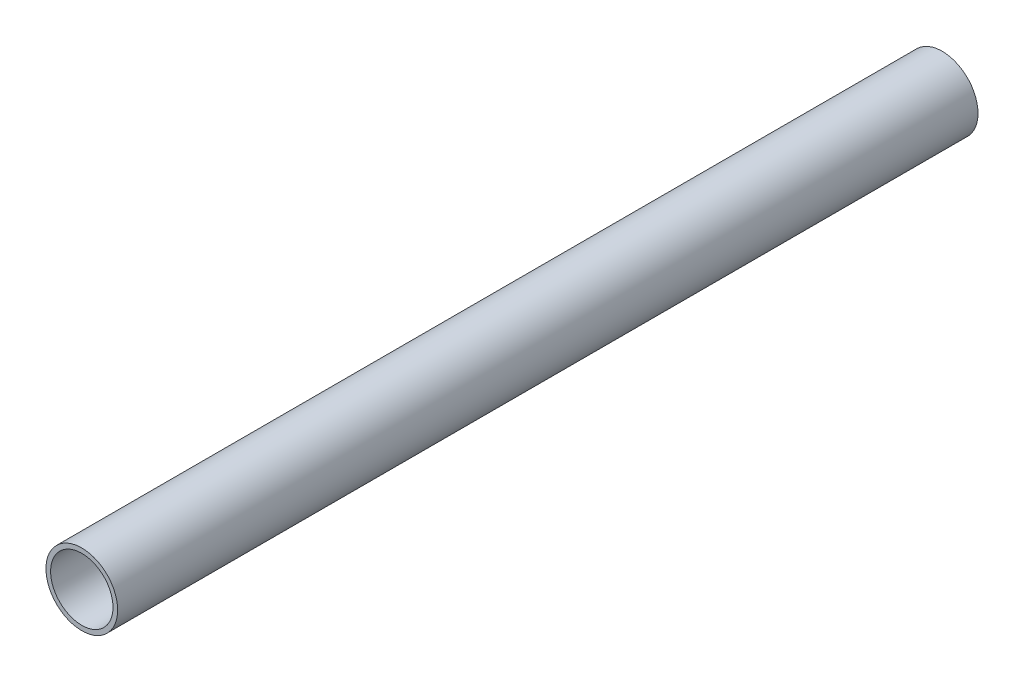
ISO-10303-21;
HEADER;
FILE_DESCRIPTION(('STEP AP214'),'2;1');
FILE_NAME('part.step','',(''),(''),'','','');
FILE_SCHEMA(('AUTOMOTIVE_DESIGN { 1 0 10303 214 1 1 1 1 }'));
ENDSEC;
DATA;
#1=APPLICATION_CONTEXT('core data for automotive mechanical design processes');
#2=APPLICATION_PROTOCOL_DEFINITION('international standard','automotive_design',2000,#1);
#3=PRODUCT_CONTEXT('',#1,'mechanical');
#4=PRODUCT('Part','Part','',(#3));
#5=PRODUCT_RELATED_PRODUCT_CATEGORY('part','',(#4));
#6=PRODUCT_DEFINITION_FORMATION('','',#4);
#7=PRODUCT_DEFINITION_CONTEXT('part definition',#1,'design');
#8=PRODUCT_DEFINITION('design','',#6,#7);
#9=PRODUCT_DEFINITION_SHAPE('','',#8);
#10=(LENGTH_UNIT() NAMED_UNIT(*) SI_UNIT(.MILLI.,.METRE.));
#11=(NAMED_UNIT(*) PLANE_ANGLE_UNIT() SI_UNIT($,.RADIAN.));
#12=(NAMED_UNIT(*) SI_UNIT($,.STERADIAN.) SOLID_ANGLE_UNIT());
#13=UNCERTAINTY_MEASURE_WITH_UNIT(LENGTH_MEASURE(1.E-05),#10,'distance_accuracy_value','');
#14=(GEOMETRIC_REPRESENTATION_CONTEXT(3) GLOBAL_UNCERTAINTY_ASSIGNED_CONTEXT((#13)) GLOBAL_UNIT_ASSIGNED_CONTEXT((#10,
#11,#12)) REPRESENTATION_CONTEXT('',''));
#15=CARTESIAN_POINT('',(0.,0.,0.));
#16=DIRECTION('',(0.,0.,1.));
#17=DIRECTION('',(1.,0.,0.));
#18=AXIS2_PLACEMENT_3D('',#15,#16,#17);
#19=CARTESIAN_POINT('',(0.,0.,152.4));
#20=DIRECTION('',(0.,0.,1.));
#21=DIRECTION('',(1.,0.,0.));
#22=AXIS2_PLACEMENT_3D('',#19,#20,#21);
#23=PLANE('',#22);
#24=CARTESIAN_POINT('',(0.,0.,152.4));
#25=DIRECTION('',(0.,0.,1.));
#26=DIRECTION('',(1.,0.,0.));
#27=AXIS2_PLACEMENT_3D('',#24,#25,#26);
#28=CIRCLE('',#27,12.7);
#29=CARTESIAN_POINT('',(12.7,0.,152.4));
#30=VERTEX_POINT('',#29);
#31=EDGE_CURVE('E10',#30,#30,#28,.T.);
#32=ORIENTED_EDGE('',*,*,#31,.T.);
#33=EDGE_LOOP('',(#32));
#34=FACE_BOUND('',#33,.T.);
#35=CARTESIAN_POINT('',(0.,0.,152.4));
#36=DIRECTION('',(0.,0.,1.));
#37=DIRECTION('',(1.,0.,0.));
#38=AXIS2_PLACEMENT_3D('',#35,#36,#37);
#39=CIRCLE('',#38,11.049);
#40=CARTESIAN_POINT('',(11.049,0.,152.4));
#41=VERTEX_POINT('',#40);
#42=EDGE_CURVE('E37',#41,#41,#39,.T.);
#43=ORIENTED_EDGE('',*,*,#42,.F.);
#44=EDGE_LOOP('',(#43));
#45=FACE_BOUND('',#44,.T.);
#46=ADVANCED_FACE('F30',(#34,#45),#23,.T.);
#47=CARTESIAN_POINT('',(0.,0.,152.4));
#48=DIRECTION('',(0.,0.,-1.));
#49=DIRECTION('',(-1.,0.,0.));
#50=AXIS2_PLACEMENT_3D('',#47,#48,#49);
#51=CYLINDRICAL_SURFACE('',#50,12.7);
#52=ORIENTED_EDGE('',*,*,#31,.F.);
#53=EDGE_LOOP('',(#52));
#54=FACE_BOUND('',#53,.T.);
#55=CARTESIAN_POINT('',(0.,0.,-152.4));
#56=DIRECTION('',(0.,0.,1.));
#57=DIRECTION('',(1.,0.,0.));
#58=AXIS2_PLACEMENT_3D('',#55,#56,#57);
#59=CIRCLE('',#58,12.7);
#60=CARTESIAN_POINT('',(12.7,0.,-152.4));
#61=VERTEX_POINT('',#60);
#62=EDGE_CURVE('E41',#61,#61,#59,.T.);
#63=ORIENTED_EDGE('',*,*,#62,.T.);
#64=EDGE_LOOP('',(#63));
#65=FACE_BOUND('',#64,.T.);
#66=ADVANCED_FACE('F32',(#54,#65),#51,.T.);
#67=CARTESIAN_POINT('',(0.,0.,152.4));
#68=DIRECTION('',(0.,0.,-1.));
#69=DIRECTION('',(-1.,0.,0.));
#70=AXIS2_PLACEMENT_3D('',#67,#68,#69);
#71=CYLINDRICAL_SURFACE('',#70,11.049);
#72=ORIENTED_EDGE('',*,*,#42,.T.);
#73=EDGE_LOOP('',(#72));
#74=FACE_BOUND('',#73,.T.);
#75=CARTESIAN_POINT('',(0.,0.,-152.4));
#76=DIRECTION('',(0.,0.,1.));
#77=DIRECTION('',(1.,0.,0.));
#78=AXIS2_PLACEMENT_3D('',#75,#76,#77);
#79=CIRCLE('',#78,11.049);
#80=CARTESIAN_POINT('',(11.049,0.,-152.4));
#81=VERTEX_POINT('',#80);
#82=EDGE_CURVE('E45',#81,#81,#79,.T.);
#83=ORIENTED_EDGE('',*,*,#82,.F.);
#84=EDGE_LOOP('',(#83));
#85=FACE_BOUND('',#84,.T.);
#86=ADVANCED_FACE('F54',(#74,#85),#71,.F.);
#87=CARTESIAN_POINT('',(0.,0.,-152.4));
#88=DIRECTION('',(0.,0.,1.));
#89=DIRECTION('',(1.,0.,0.));
#90=AXIS2_PLACEMENT_3D('',#87,#88,#89);
#91=PLANE('',#90);
#92=ORIENTED_EDGE('',*,*,#82,.T.);
#93=EDGE_LOOP('',(#92));
#94=FACE_BOUND('',#93,.T.);
#95=ORIENTED_EDGE('',*,*,#62,.F.);
#96=EDGE_LOOP('',(#95));
#97=FACE_BOUND('',#96,.T.);
#98=ADVANCED_FACE('F51',(#94,#97),#91,.F.);
#99=CLOSED_SHELL('',(#46,#66,#86,#98));
#100=MANIFOLD_SOLID_BREP('B2',#99);
#101=ADVANCED_BREP_SHAPE_REPRESENTATION('',(#18,#100),#14);
#102=SHAPE_DEFINITION_REPRESENTATION(#9,#101);
ENDSEC;
END-ISO-10303-21;
